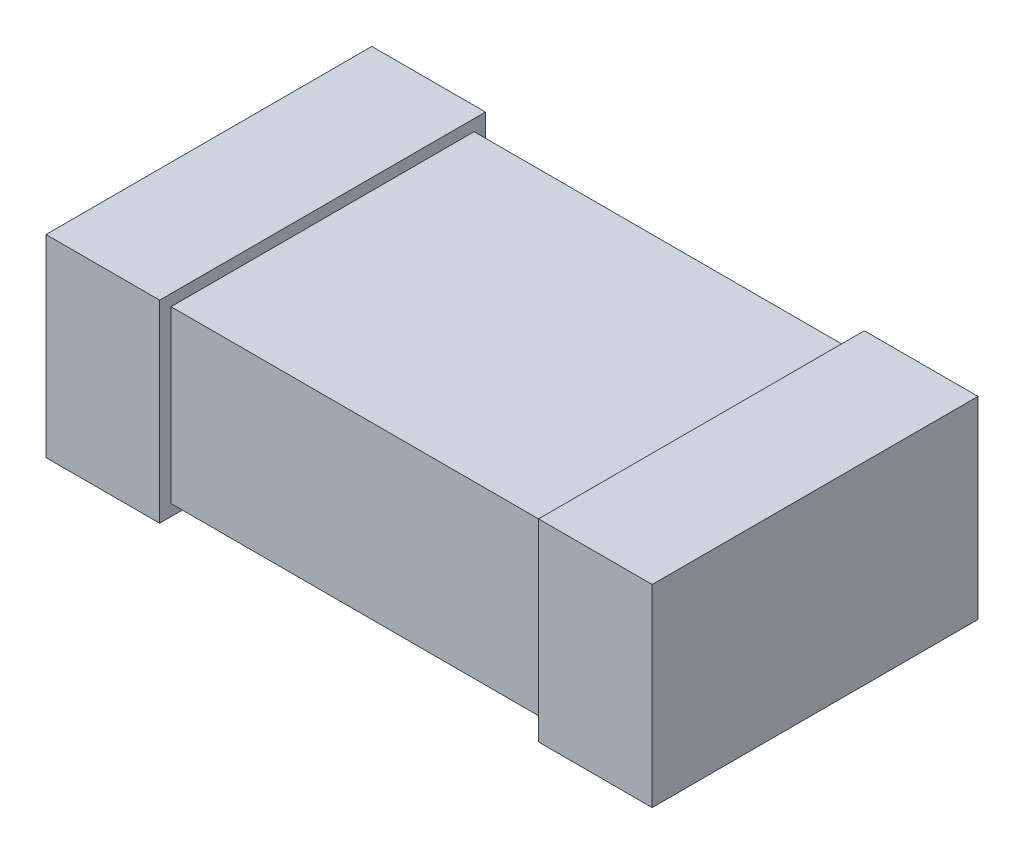
ISO-10303-21;
HEADER;
FILE_DESCRIPTION(('STEP AP214'),'2;1');
FILE_NAME('part.step','',(''),(''),'','','');
FILE_SCHEMA(('AUTOMOTIVE_DESIGN { 1 0 10303 214 1 1 1 1 }'));
ENDSEC;
DATA;
#1=APPLICATION_CONTEXT('core data for automotive mechanical design processes');
#2=APPLICATION_PROTOCOL_DEFINITION('international standard','automotive_design',2000,#1);
#3=PRODUCT_CONTEXT('',#1,'mechanical');
#4=PRODUCT('Part','Part','',(#3));
#5=PRODUCT_RELATED_PRODUCT_CATEGORY('part','',(#4));
#6=PRODUCT_DEFINITION_FORMATION('','',#4);
#7=PRODUCT_DEFINITION_CONTEXT('part definition',#1,'design');
#8=PRODUCT_DEFINITION('design','',#6,#7);
#9=PRODUCT_DEFINITION_SHAPE('','',#8);
#10=(LENGTH_UNIT() NAMED_UNIT(*) SI_UNIT(.MILLI.,.METRE.));
#11=(NAMED_UNIT(*) PLANE_ANGLE_UNIT() SI_UNIT($,.RADIAN.));
#12=(NAMED_UNIT(*) SI_UNIT($,.STERADIAN.) SOLID_ANGLE_UNIT());
#13=UNCERTAINTY_MEASURE_WITH_UNIT(LENGTH_MEASURE(1.E-05),#10,'distance_accuracy_value','');
#14=(GEOMETRIC_REPRESENTATION_CONTEXT(3) GLOBAL_UNCERTAINTY_ASSIGNED_CONTEXT((#13)) GLOBAL_UNIT_ASSIGNED_CONTEXT((#10,
#11,#12)) REPRESENTATION_CONTEXT('',''));
#15=CARTESIAN_POINT('',(0.,0.,0.));
#16=DIRECTION('',(0.,0.,1.));
#17=DIRECTION('',(1.,0.,0.));
#18=AXIS2_PLACEMENT_3D('',#15,#16,#17);
#19=CARTESIAN_POINT('',(-0.8,0.45,0.4));
#20=DIRECTION('',(0.,0.,-1.));
#21=DIRECTION('',(-1.,0.,0.));
#22=AXIS2_PLACEMENT_3D('',#19,#20,#21);
#23=PLANE('',#22);
#24=DIRECTION('',(0.,-1.,0.));
#25=VECTOR('',#24,1.);
#26=CARTESIAN_POINT('',(0.5,0.450000000000001,0.4));
#27=LINE('',#26,#25);
#28=CARTESIAN_POINT('',(0.5,0.45,0.4));
#29=VERTEX_POINT('',#28);
#30=CARTESIAN_POINT('',(0.5,0.,0.4));
#31=VERTEX_POINT('',#30);
#32=EDGE_CURVE('E54',#29,#31,#27,.T.);
#33=ORIENTED_EDGE('',*,*,#32,.F.);
#34=DIRECTION('',(1.,0.,0.));
#35=VECTOR('',#34,1.);
#36=CARTESIAN_POINT('',(-0.8,0.45,0.4));
#37=LINE('',#36,#35);
#38=CARTESIAN_POINT('',(-0.5,0.45,0.4));
#39=VERTEX_POINT('',#38);
#40=EDGE_CURVE('E219',#39,#29,#37,.T.);
#41=ORIENTED_EDGE('',*,*,#40,.F.);
#42=DIRECTION('',(0.,1.,0.));
#43=VECTOR('',#42,1.);
#44=CARTESIAN_POINT('',(-0.5,0.45,0.4));
#45=LINE('',#44,#43);
#46=CARTESIAN_POINT('',(-0.5,0.,0.4));
#47=VERTEX_POINT('',#46);
#48=EDGE_CURVE('E213',#47,#39,#45,.T.);
#49=ORIENTED_EDGE('',*,*,#48,.F.);
#50=DIRECTION('',(1.,0.,0.));
#51=VECTOR('',#50,1.);
#52=CARTESIAN_POINT('',(-0.8,0.,0.4));
#53=LINE('',#52,#51);
#54=EDGE_CURVE('E218',#47,#31,#53,.T.);
#55=ORIENTED_EDGE('',*,*,#54,.T.);
#56=EDGE_LOOP('',(#33,#41,#49,#55));
#57=FACE_BOUND('',#56,.T.);
#58=ADVANCED_FACE('F39',(#57),#23,.F.);
#59=CARTESIAN_POINT('',(-0.8,0.45,-0.4));
#60=DIRECTION('',(0.,0.,1.));
#61=DIRECTION('',(1.,0.,0.));
#62=AXIS2_PLACEMENT_3D('',#59,#60,#61);
#63=PLANE('',#62);
#64=DIRECTION('',(0.,1.,0.));
#65=VECTOR('',#64,1.);
#66=CARTESIAN_POINT('',(0.5,0.450000000000001,-0.4));
#67=LINE('',#66,#65);
#68=CARTESIAN_POINT('',(0.5,0.,-0.4));
#69=VERTEX_POINT('',#68);
#70=CARTESIAN_POINT('',(0.5,0.45,-0.4));
#71=VERTEX_POINT('',#70);
#72=EDGE_CURVE('E168',#69,#71,#67,.T.);
#73=ORIENTED_EDGE('',*,*,#72,.F.);
#74=DIRECTION('',(-1.,0.,0.));
#75=VECTOR('',#74,1.);
#76=CARTESIAN_POINT('',(-0.8,0.,-0.4));
#77=LINE('',#76,#75);
#78=CARTESIAN_POINT('',(-0.5,0.,-0.4));
#79=VERTEX_POINT('',#78);
#80=EDGE_CURVE('E222',#69,#79,#77,.T.);
#81=ORIENTED_EDGE('',*,*,#80,.T.);
#82=DIRECTION('',(0.,-1.,0.));
#83=VECTOR('',#82,1.);
#84=CARTESIAN_POINT('',(-0.5,0.45,-0.4));
#85=LINE('',#84,#83);
#86=CARTESIAN_POINT('',(-0.5,0.45,-0.4));
#87=VERTEX_POINT('',#86);
#88=EDGE_CURVE('E201',#87,#79,#85,.T.);
#89=ORIENTED_EDGE('',*,*,#88,.F.);
#90=DIRECTION('',(-1.,0.,0.));
#91=VECTOR('',#90,1.);
#92=CARTESIAN_POINT('',(-0.8,0.45,-0.4));
#93=LINE('',#92,#91);
#94=EDGE_CURVE('E221',#71,#87,#93,.T.);
#95=ORIENTED_EDGE('',*,*,#94,.F.);
#96=EDGE_LOOP('',(#73,#81,#89,#95));
#97=FACE_BOUND('',#96,.T.);
#98=ADVANCED_FACE('F239',(#97),#63,.F.);
#99=CARTESIAN_POINT('',(-0.8,0.45,0.4));
#100=DIRECTION('',(0.,1.,0.));
#101=DIRECTION('',(0.,0.,1.));
#102=AXIS2_PLACEMENT_3D('',#99,#100,#101);
#103=PLANE('',#102);
#104=ORIENTED_EDGE('',*,*,#40,.T.);
#105=DIRECTION('',(0.,0.,-1.));
#106=VECTOR('',#105,1.);
#107=CARTESIAN_POINT('',(0.5,0.45,0.4));
#108=LINE('',#107,#106);
#109=EDGE_CURVE('E61',#29,#71,#108,.T.);
#110=ORIENTED_EDGE('',*,*,#109,.T.);
#111=ORIENTED_EDGE('',*,*,#94,.T.);
#112=DIRECTION('',(0.,0.,1.));
#113=VECTOR('',#112,1.);
#114=CARTESIAN_POINT('',(-0.5,0.45,0.4));
#115=LINE('',#114,#113);
#116=EDGE_CURVE('E216',#87,#39,#115,.T.);
#117=ORIENTED_EDGE('',*,*,#116,.T.);
#118=EDGE_LOOP('',(#104,#110,#111,#117));
#119=FACE_BOUND('',#118,.T.);
#120=ADVANCED_FACE('F236',(#119),#103,.T.);
#121=CARTESIAN_POINT('',(-0.8,0.,0.4));
#122=DIRECTION('',(0.,1.,0.));
#123=DIRECTION('',(0.,0.,1.));
#124=AXIS2_PLACEMENT_3D('',#121,#122,#123);
#125=PLANE('',#124);
#126=DIRECTION('',(0.,0.,-1.));
#127=VECTOR('',#126,1.);
#128=CARTESIAN_POINT('',(0.5,0.,0.4));
#129=LINE('',#128,#127);
#130=EDGE_CURVE('E12',#31,#69,#129,.T.);
#131=ORIENTED_EDGE('',*,*,#130,.F.);
#132=ORIENTED_EDGE('',*,*,#54,.F.);
#133=DIRECTION('',(0.,0.,1.));
#134=VECTOR('',#133,1.);
#135=CARTESIAN_POINT('',(-0.5,0.,0.4));
#136=LINE('',#135,#134);
#137=EDGE_CURVE('E47',#79,#47,#136,.T.);
#138=ORIENTED_EDGE('',*,*,#137,.F.);
#139=ORIENTED_EDGE('',*,*,#80,.F.);
#140=EDGE_LOOP('',(#131,#132,#138,#139));
#141=FACE_BOUND('',#140,.T.);
#142=ADVANCED_FACE('F234',(#141),#125,.F.);
#143=CARTESIAN_POINT('',(-0.5,-0.03,1.05169248769948));
#144=DIRECTION('',(0.,1.,0.));
#145=DIRECTION('',(-1.,0.,0.));
#146=AXIS2_PLACEMENT_3D('',#143,#144,#145);
#147=PLANE('',#146);
#148=DIRECTION('',(0.,0.,-1.));
#149=VECTOR('',#148,1.);
#150=CARTESIAN_POINT('',(-0.5,-0.03,1.05169248769948));
#151=LINE('',#150,#149);
#152=CARTESIAN_POINT('',(-0.5,-0.03,0.43));
#153=VERTEX_POINT('',#152);
#154=CARTESIAN_POINT('',(-0.5,-0.03,-0.43));
#155=VERTEX_POINT('',#154);
#156=EDGE_CURVE('E190',#153,#155,#151,.T.);
#157=ORIENTED_EDGE('',*,*,#156,.F.);
#158=DIRECTION('',(-1.,0.,0.));
#159=VECTOR('',#158,1.);
#160=CARTESIAN_POINT('',(-0.5,-0.03,0.43));
#161=LINE('',#160,#159);
#162=CARTESIAN_POINT('',(-0.8,-0.03,0.43));
#163=VERTEX_POINT('',#162);
#164=EDGE_CURVE('E195',#153,#163,#161,.T.);
#165=ORIENTED_EDGE('',*,*,#164,.T.);
#166=DIRECTION('',(0.,0.,-1.));
#167=VECTOR('',#166,1.);
#168=CARTESIAN_POINT('',(-0.8,-0.03,1.05169248769948));
#169=LINE('',#168,#167);
#170=CARTESIAN_POINT('',(-0.8,-0.03,-0.43));
#171=VERTEX_POINT('',#170);
#172=EDGE_CURVE('E203',#163,#171,#169,.T.);
#173=ORIENTED_EDGE('',*,*,#172,.T.);
#174=DIRECTION('',(-1.,0.,0.));
#175=VECTOR('',#174,1.);
#176=CARTESIAN_POINT('',(-0.5,-0.03,-0.43));
#177=LINE('',#176,#175);
#178=EDGE_CURVE('E181',#155,#171,#177,.T.);
#179=ORIENTED_EDGE('',*,*,#178,.F.);
#180=EDGE_LOOP('',(#157,#165,#173,#179));
#181=FACE_BOUND('',#180,.T.);
#182=ADVANCED_FACE('F280',(#181),#147,.F.);
#183=CARTESIAN_POINT('',(-0.5,0.48,1.05169248769948));
#184=DIRECTION('',(0.,-1.,0.));
#185=DIRECTION('',(0.,0.,-1.));
#186=AXIS2_PLACEMENT_3D('',#183,#184,#185);
#187=PLANE('',#186);
#188=DIRECTION('',(0.,0.,-1.));
#189=VECTOR('',#188,1.);
#190=CARTESIAN_POINT('',(-0.8,0.48,1.05169248769948));
#191=LINE('',#190,#189);
#192=CARTESIAN_POINT('',(-0.8,0.48,0.43));
#193=VERTEX_POINT('',#192);
#194=CARTESIAN_POINT('',(-0.8,0.48,-0.43));
#195=VERTEX_POINT('',#194);
#196=EDGE_CURVE('E205',#193,#195,#191,.T.);
#197=ORIENTED_EDGE('',*,*,#196,.F.);
#198=DIRECTION('',(1.,0.,0.));
#199=VECTOR('',#198,1.);
#200=CARTESIAN_POINT('',(-0.5,0.48,0.43));
#201=LINE('',#200,#199);
#202=CARTESIAN_POINT('',(-0.5,0.48,0.43));
#203=VERTEX_POINT('',#202);
#204=EDGE_CURVE('E194',#193,#203,#201,.T.);
#205=ORIENTED_EDGE('',*,*,#204,.T.);
#206=DIRECTION('',(0.,0.,-1.));
#207=VECTOR('',#206,1.);
#208=CARTESIAN_POINT('',(-0.5,0.48,1.05169248769948));
#209=LINE('',#208,#207);
#210=CARTESIAN_POINT('',(-0.5,0.48,-0.43));
#211=VERTEX_POINT('',#210);
#212=EDGE_CURVE('E207',#203,#211,#209,.T.);
#213=ORIENTED_EDGE('',*,*,#212,.T.);
#214=DIRECTION('',(1.,0.,0.));
#215=VECTOR('',#214,1.);
#216=CARTESIAN_POINT('',(-0.5,0.48,-0.43));
#217=LINE('',#216,#215);
#218=EDGE_CURVE('E187',#195,#211,#217,.T.);
#219=ORIENTED_EDGE('',*,*,#218,.F.);
#220=EDGE_LOOP('',(#197,#205,#213,#219));
#221=FACE_BOUND('',#220,.T.);
#222=ADVANCED_FACE('F283',(#221),#187,.F.);
#223=CARTESIAN_POINT('',(-0.5,0.48,1.05169248769948));
#224=DIRECTION('',(-1.,0.,0.));
#225=DIRECTION('',(0.,0.,1.));
#226=AXIS2_PLACEMENT_3D('',#223,#224,#225);
#227=PLANE('',#226);
#228=ORIENTED_EDGE('',*,*,#116,.F.);
#229=ORIENTED_EDGE('',*,*,#88,.T.);
#230=ORIENTED_EDGE('',*,*,#137,.T.);
#231=ORIENTED_EDGE('',*,*,#48,.T.);
#232=EDGE_LOOP('',(#228,#229,#230,#231));
#233=FACE_BOUND('',#232,.T.);
#234=ORIENTED_EDGE('',*,*,#212,.F.);
#235=DIRECTION('',(0.,-1.,0.));
#236=VECTOR('',#235,1.);
#237=CARTESIAN_POINT('',(-0.5,0.48,0.43));
#238=LINE('',#237,#236);
#239=EDGE_CURVE('E198',#203,#153,#238,.T.);
#240=ORIENTED_EDGE('',*,*,#239,.T.);
#241=ORIENTED_EDGE('',*,*,#156,.T.);
#242=DIRECTION('',(0.,-1.,0.));
#243=VECTOR('',#242,1.);
#244=CARTESIAN_POINT('',(-0.5,0.48,-0.43));
#245=LINE('',#244,#243);
#246=EDGE_CURVE('E184',#211,#155,#245,.T.);
#247=ORIENTED_EDGE('',*,*,#246,.F.);
#248=EDGE_LOOP('',(#234,#240,#241,#247));
#249=FACE_BOUND('',#248,.T.);
#250=ADVANCED_FACE('F229',(#233,#249),#227,.F.);
#251=CARTESIAN_POINT('',(-0.8,0.45,0.43));
#252=DIRECTION('',(0.,0.,-1.));
#253=DIRECTION('',(-1.,0.,0.));
#254=AXIS2_PLACEMENT_3D('',#251,#252,#253);
#255=PLANE('',#254);
#256=ORIENTED_EDGE('',*,*,#204,.F.);
#257=DIRECTION('',(0.,1.,0.));
#258=VECTOR('',#257,1.);
#259=CARTESIAN_POINT('',(-0.8,0.48,0.43));
#260=LINE('',#259,#258);
#261=EDGE_CURVE('E191',#163,#193,#260,.T.);
#262=ORIENTED_EDGE('',*,*,#261,.F.);
#263=ORIENTED_EDGE('',*,*,#164,.F.);
#264=ORIENTED_EDGE('',*,*,#239,.F.);
#265=EDGE_LOOP('',(#256,#262,#263,#264));
#266=FACE_BOUND('',#265,.T.);
#267=ADVANCED_FACE('F275',(#266),#255,.F.);
#268=CARTESIAN_POINT('',(-0.8,0.45,-0.43));
#269=DIRECTION('',(0.,0.,1.));
#270=DIRECTION('',(1.,0.,0.));
#271=AXIS2_PLACEMENT_3D('',#268,#269,#270);
#272=PLANE('',#271);
#273=ORIENTED_EDGE('',*,*,#246,.T.);
#274=ORIENTED_EDGE('',*,*,#178,.T.);
#275=DIRECTION('',(0.,1.,0.));
#276=VECTOR('',#275,1.);
#277=CARTESIAN_POINT('',(-0.8,0.48,-0.43));
#278=LINE('',#277,#276);
#279=EDGE_CURVE('E178',#171,#195,#278,.T.);
#280=ORIENTED_EDGE('',*,*,#279,.T.);
#281=ORIENTED_EDGE('',*,*,#218,.T.);
#282=EDGE_LOOP('',(#273,#274,#280,#281));
#283=FACE_BOUND('',#282,.T.);
#284=ADVANCED_FACE('F272',(#283),#272,.F.);
#285=CARTESIAN_POINT('',(-0.8,0.45,-0.4));
#286=DIRECTION('',(1.,0.,0.));
#287=DIRECTION('',(0.,0.,-1.));
#288=AXIS2_PLACEMENT_3D('',#285,#286,#287);
#289=PLANE('',#288);
#290=ORIENTED_EDGE('',*,*,#172,.F.);
#291=ORIENTED_EDGE('',*,*,#261,.T.);
#292=ORIENTED_EDGE('',*,*,#196,.T.);
#293=ORIENTED_EDGE('',*,*,#279,.F.);
#294=EDGE_LOOP('',(#290,#291,#292,#293));
#295=FACE_BOUND('',#294,.T.);
#296=ADVANCED_FACE('F41',(#295),#289,.F.);
#297=CARTESIAN_POINT('',(0.5,-0.0299999999999999,1.05169248769948));
#298=DIRECTION('',(0.,1.,0.));
#299=DIRECTION('',(-1.,0.,0.));
#300=AXIS2_PLACEMENT_3D('',#297,#298,#299);
#301=PLANE('',#300);
#302=DIRECTION('',(0.,0.,-1.));
#303=VECTOR('',#302,1.);
#304=CARTESIAN_POINT('',(0.8,-0.0299999999999998,1.05169248769948));
#305=LINE('',#304,#303);
#306=CARTESIAN_POINT('',(0.8,-0.0299999999999998,0.43));
#307=VERTEX_POINT('',#306);
#308=CARTESIAN_POINT('',(0.8,-0.0299999999999998,-0.43));
#309=VERTEX_POINT('',#308);
#310=EDGE_CURVE('E141',#307,#309,#305,.T.);
#311=ORIENTED_EDGE('',*,*,#310,.F.);
#312=DIRECTION('',(-1.,0.,0.));
#313=VECTOR('',#312,1.);
#314=CARTESIAN_POINT('',(0.5,-0.0299999999999999,0.43));
#315=LINE('',#314,#313);
#316=CARTESIAN_POINT('',(0.5,-0.0299999999999999,0.43));
#317=VERTEX_POINT('',#316);
#318=EDGE_CURVE('E136',#307,#317,#315,.T.);
#319=ORIENTED_EDGE('',*,*,#318,.T.);
#320=DIRECTION('',(0.,0.,-1.));
#321=VECTOR('',#320,1.);
#322=CARTESIAN_POINT('',(0.5,-0.0299999999999999,1.05169248769948));
#323=LINE('',#322,#321);
#324=CARTESIAN_POINT('',(0.5,-0.0299999999999999,-0.43));
#325=VERTEX_POINT('',#324);
#326=EDGE_CURVE('E131',#317,#325,#323,.T.);
#327=ORIENTED_EDGE('',*,*,#326,.T.);
#328=DIRECTION('',(-1.,0.,0.));
#329=VECTOR('',#328,1.);
#330=CARTESIAN_POINT('',(0.5,-0.0299999999999999,-0.43));
#331=LINE('',#330,#329);
#332=EDGE_CURVE('E135',#309,#325,#331,.T.);
#333=ORIENTED_EDGE('',*,*,#332,.F.);
#334=EDGE_LOOP('',(#311,#319,#327,#333));
#335=FACE_BOUND('',#334,.T.);
#336=ADVANCED_FACE('F134',(#335),#301,.F.);
#337=CARTESIAN_POINT('',(0.5,0.48,1.05169248769948));
#338=DIRECTION('',(1.,0.,0.));
#339=DIRECTION('',(0.,1.,0.));
#340=AXIS2_PLACEMENT_3D('',#337,#338,#339);
#341=PLANE('',#340);
#342=ORIENTED_EDGE('',*,*,#109,.F.);
#343=ORIENTED_EDGE('',*,*,#32,.T.);
#344=ORIENTED_EDGE('',*,*,#130,.T.);
#345=ORIENTED_EDGE('',*,*,#72,.T.);
#346=EDGE_LOOP('',(#342,#343,#344,#345));
#347=FACE_BOUND('',#346,.T.);
#348=ORIENTED_EDGE('',*,*,#326,.F.);
#349=DIRECTION('',(0.,1.,0.));
#350=VECTOR('',#349,1.);
#351=CARTESIAN_POINT('',(0.5,0.48,0.43));
#352=LINE('',#351,#350);
#353=CARTESIAN_POINT('',(0.5,0.48,0.43));
#354=VERTEX_POINT('',#353);
#355=EDGE_CURVE('E163',#317,#354,#352,.T.);
#356=ORIENTED_EDGE('',*,*,#355,.T.);
#357=DIRECTION('',(0.,0.,-1.));
#358=VECTOR('',#357,1.);
#359=CARTESIAN_POINT('',(0.5,0.48,1.05169248769948));
#360=LINE('',#359,#358);
#361=CARTESIAN_POINT('',(0.5,0.48,-0.43));
#362=VERTEX_POINT('',#361);
#363=EDGE_CURVE('E140',#354,#362,#360,.T.);
#364=ORIENTED_EDGE('',*,*,#363,.T.);
#365=DIRECTION('',(0.,1.,0.));
#366=VECTOR('',#365,1.);
#367=CARTESIAN_POINT('',(0.5,0.48,-0.43));
#368=LINE('',#367,#366);
#369=EDGE_CURVE('E148',#325,#362,#368,.T.);
#370=ORIENTED_EDGE('',*,*,#369,.F.);
#371=EDGE_LOOP('',(#348,#356,#364,#370));
#372=FACE_BOUND('',#371,.T.);
#373=ADVANCED_FACE('F153',(#347,#372),#341,.F.);
#374=CARTESIAN_POINT('',(0.5,0.48,1.05169248769948));
#375=DIRECTION('',(0.,-1.,0.));
#376=DIRECTION('',(1.,0.,0.));
#377=AXIS2_PLACEMENT_3D('',#374,#375,#376);
#378=PLANE('',#377);
#379=ORIENTED_EDGE('',*,*,#363,.F.);
#380=DIRECTION('',(1.,0.,0.));
#381=VECTOR('',#380,1.);
#382=CARTESIAN_POINT('',(0.5,0.48,0.43));
#383=LINE('',#382,#381);
#384=CARTESIAN_POINT('',(0.8,0.48,0.43));
#385=VERTEX_POINT('',#384);
#386=EDGE_CURVE('E166',#354,#385,#383,.T.);
#387=ORIENTED_EDGE('',*,*,#386,.T.);
#388=DIRECTION('',(0.,0.,-1.));
#389=VECTOR('',#388,1.);
#390=CARTESIAN_POINT('',(0.8,0.48,1.05169248769948));
#391=LINE('',#390,#389);
#392=CARTESIAN_POINT('',(0.8,0.48,-0.43));
#393=VERTEX_POINT('',#392);
#394=EDGE_CURVE('E155',#385,#393,#391,.T.);
#395=ORIENTED_EDGE('',*,*,#394,.T.);
#396=DIRECTION('',(1.,0.,0.));
#397=VECTOR('',#396,1.);
#398=CARTESIAN_POINT('',(0.5,0.48,-0.43));
#399=LINE('',#398,#397);
#400=EDGE_CURVE('E156',#362,#393,#399,.T.);
#401=ORIENTED_EDGE('',*,*,#400,.F.);
#402=EDGE_LOOP('',(#379,#387,#395,#401));
#403=FACE_BOUND('',#402,.T.);
#404=ADVANCED_FACE('F259',(#403),#378,.F.);
#405=CARTESIAN_POINT('',(-0.8,0.45,0.43));
#406=DIRECTION('',(0.,0.,-1.));
#407=DIRECTION('',(-1.,0.,0.));
#408=AXIS2_PLACEMENT_3D('',#405,#406,#407);
#409=PLANE('',#408);
#410=ORIENTED_EDGE('',*,*,#355,.F.);
#411=ORIENTED_EDGE('',*,*,#318,.F.);
#412=DIRECTION('',(0.,-1.,0.));
#413=VECTOR('',#412,1.);
#414=CARTESIAN_POINT('',(0.8,0.48,0.43));
#415=LINE('',#414,#413);
#416=EDGE_CURVE('E164',#385,#307,#415,.T.);
#417=ORIENTED_EDGE('',*,*,#416,.F.);
#418=ORIENTED_EDGE('',*,*,#386,.F.);
#419=EDGE_LOOP('',(#410,#411,#417,#418));
#420=FACE_BOUND('',#419,.T.);
#421=ADVANCED_FACE('F255',(#420),#409,.F.);
#422=CARTESIAN_POINT('',(-0.8,0.45,-0.43));
#423=DIRECTION('',(0.,0.,1.));
#424=DIRECTION('',(1.,0.,0.));
#425=AXIS2_PLACEMENT_3D('',#422,#423,#424);
#426=PLANE('',#425);
#427=ORIENTED_EDGE('',*,*,#400,.T.);
#428=DIRECTION('',(0.,-1.,0.));
#429=VECTOR('',#428,1.);
#430=CARTESIAN_POINT('',(0.8,0.48,-0.43));
#431=LINE('',#430,#429);
#432=EDGE_CURVE('E151',#393,#309,#431,.T.);
#433=ORIENTED_EDGE('',*,*,#432,.T.);
#434=ORIENTED_EDGE('',*,*,#332,.T.);
#435=ORIENTED_EDGE('',*,*,#369,.T.);
#436=EDGE_LOOP('',(#427,#433,#434,#435));
#437=FACE_BOUND('',#436,.T.);
#438=ADVANCED_FACE('F147',(#437),#426,.F.);
#439=CARTESIAN_POINT('',(0.8,0.45,-0.4));
#440=DIRECTION('',(-1.,0.,0.));
#441=DIRECTION('',(0.,0.,1.));
#442=AXIS2_PLACEMENT_3D('',#439,#440,#441);
#443=PLANE('',#442);
#444=ORIENTED_EDGE('',*,*,#394,.F.);
#445=ORIENTED_EDGE('',*,*,#416,.T.);
#446=ORIENTED_EDGE('',*,*,#310,.T.);
#447=ORIENTED_EDGE('',*,*,#432,.F.);
#448=EDGE_LOOP('',(#444,#445,#446,#447));
#449=FACE_BOUND('',#448,.T.);
#450=ADVANCED_FACE('F249',(#449),#443,.F.);
#451=CLOSED_SHELL('',(#58,#98,#120,#142,#182,#222,#250,#267,#284,#296,#336,#373,#404,#421,#438,#450));
#452=MANIFOLD_SOLID_BREP('B2',#451);
#453=ADVANCED_BREP_SHAPE_REPRESENTATION('',(#18,#452),#14);
#454=SHAPE_DEFINITION_REPRESENTATION(#9,#453);
ENDSEC;
END-ISO-10303-21;
